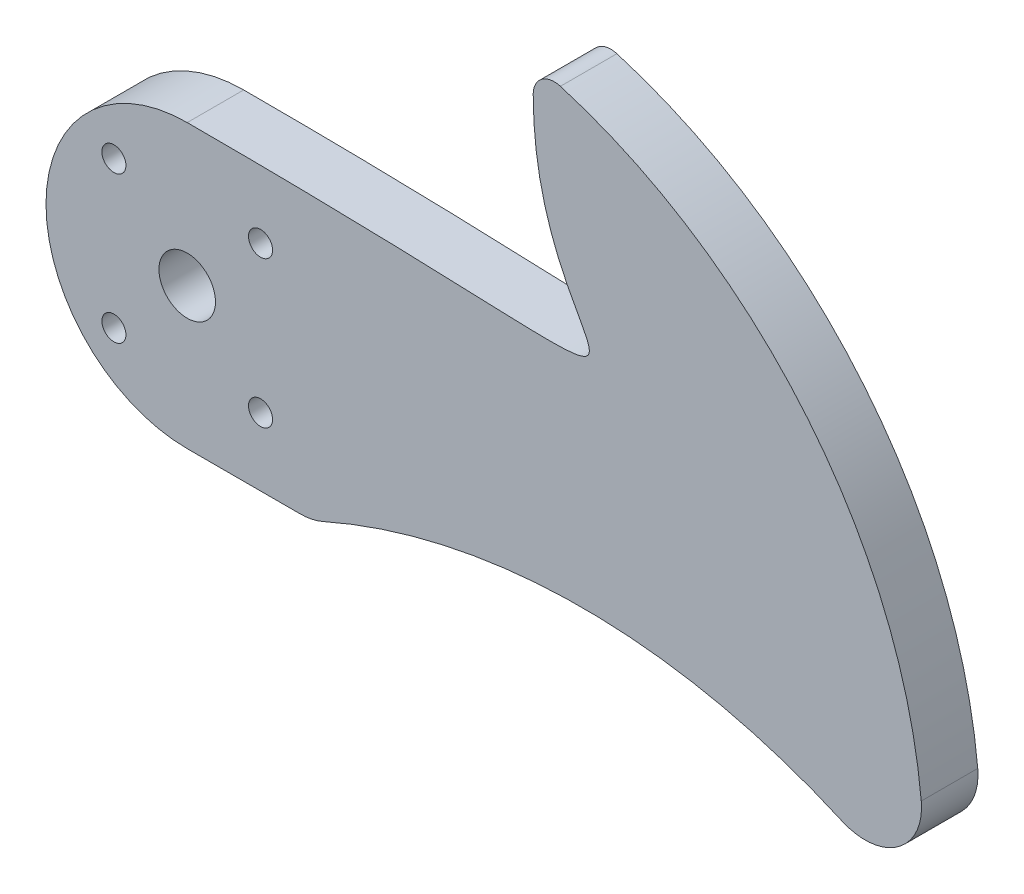
ISO-10303-21;
HEADER;
FILE_DESCRIPTION(('STEP AP214'),'2;1');
FILE_NAME('part.step','',(''),(''),'','','');
FILE_SCHEMA(('AUTOMOTIVE_DESIGN { 1 0 10303 214 1 1 1 1 }'));
ENDSEC;
DATA;
#1=APPLICATION_CONTEXT('core data for automotive mechanical design processes');
#2=APPLICATION_PROTOCOL_DEFINITION('international standard','automotive_design',2000,#1);
#3=PRODUCT_CONTEXT('',#1,'mechanical');
#4=PRODUCT('Part','Part','',(#3));
#5=PRODUCT_RELATED_PRODUCT_CATEGORY('part','',(#4));
#6=PRODUCT_DEFINITION_FORMATION('','',#4);
#7=PRODUCT_DEFINITION_CONTEXT('part definition',#1,'design');
#8=PRODUCT_DEFINITION('design','',#6,#7);
#9=PRODUCT_DEFINITION_SHAPE('','',#8);
#10=(LENGTH_UNIT() NAMED_UNIT(*) SI_UNIT(.MILLI.,.METRE.));
#11=(NAMED_UNIT(*) PLANE_ANGLE_UNIT() SI_UNIT($,.RADIAN.));
#12=(NAMED_UNIT(*) SI_UNIT($,.STERADIAN.) SOLID_ANGLE_UNIT());
#13=UNCERTAINTY_MEASURE_WITH_UNIT(LENGTH_MEASURE(1.E-05),#10,'distance_accuracy_value','');
#14=(GEOMETRIC_REPRESENTATION_CONTEXT(3) GLOBAL_UNCERTAINTY_ASSIGNED_CONTEXT((#13)) GLOBAL_UNIT_ASSIGNED_CONTEXT((#10,
#11,#12)) REPRESENTATION_CONTEXT('',''));
#15=CARTESIAN_POINT('',(0.,0.,0.));
#16=DIRECTION('',(0.,0.,1.));
#17=DIRECTION('',(1.,0.,0.));
#18=AXIS2_PLACEMENT_3D('',#15,#16,#17);
#19=CARTESIAN_POINT('',(0.,0.,6.35));
#20=DIRECTION('',(0.,0.,1.));
#21=DIRECTION('',(1.,0.,0.));
#22=AXIS2_PLACEMENT_3D('',#19,#20,#21);
#23=PLANE('',#22);
#24=CARTESIAN_POINT('',(8.24239019490099,8.24239019490099,6.35));
#25=DIRECTION('',(0.,0.,1.));
#26=DIRECTION('',(1.,0.,0.));
#27=AXIS2_PLACEMENT_3D('',#24,#25,#26);
#28=CIRCLE('',#27,1.35254999999999);
#29=CARTESIAN_POINT('',(9.59494019490098,8.24239019490099,6.35));
#30=VERTEX_POINT('',#29);
#31=EDGE_CURVE('E247',#30,#30,#28,.T.);
#32=ORIENTED_EDGE('',*,*,#31,.F.);
#33=EDGE_LOOP('',(#32));
#34=FACE_BOUND('',#33,.T.);
#35=CARTESIAN_POINT('',(-8.24239019490106,8.24239019490092,6.35));
#36=DIRECTION('',(0.,0.,1.));
#37=DIRECTION('',(1.,0.,0.));
#38=AXIS2_PLACEMENT_3D('',#35,#36,#37);
#39=CIRCLE('',#38,1.35254999999999);
#40=CARTESIAN_POINT('',(-6.88984019490108,8.24239019490092,6.35));
#41=VERTEX_POINT('',#40);
#42=EDGE_CURVE('E257',#41,#41,#39,.T.);
#43=ORIENTED_EDGE('',*,*,#42,.F.);
#44=EDGE_LOOP('',(#43));
#45=FACE_BOUND('',#44,.T.);
#46=CARTESIAN_POINT('',(8.24239019490106,-8.24239019490092,6.35));
#47=DIRECTION('',(0.,0.,1.));
#48=DIRECTION('',(1.,0.,0.));
#49=AXIS2_PLACEMENT_3D('',#46,#47,#48);
#50=CIRCLE('',#49,1.35254999999999);
#51=CARTESIAN_POINT('',(9.59494019490105,-8.24239019490092,6.35));
#52=VERTEX_POINT('',#51);
#53=EDGE_CURVE('E265',#52,#52,#50,.T.);
#54=ORIENTED_EDGE('',*,*,#53,.F.);
#55=EDGE_LOOP('',(#54));
#56=FACE_BOUND('',#55,.T.);
#57=CARTESIAN_POINT('',(-8.24239019490099,-8.24239019490099,6.35));
#58=DIRECTION('',(0.,0.,1.));
#59=DIRECTION('',(1.,0.,0.));
#60=AXIS2_PLACEMENT_3D('',#57,#58,#59);
#61=CIRCLE('',#60,1.35254999999999);
#62=CARTESIAN_POINT('',(-6.889840194901,-8.24239019490099,6.35));
#63=VERTEX_POINT('',#62);
#64=EDGE_CURVE('E273',#63,#63,#61,.T.);
#65=ORIENTED_EDGE('',*,*,#64,.F.);
#66=EDGE_LOOP('',(#65));
#67=FACE_BOUND('',#66,.T.);
#68=CARTESIAN_POINT('',(0.,0.,6.35));
#69=DIRECTION('',(0.,0.,1.));
#70=DIRECTION('',(1.,0.,0.));
#71=AXIS2_PLACEMENT_3D('',#68,#69,#70);
#72=CIRCLE('',#71,15.875);
#73=CARTESIAN_POINT('',(-1.2140077555456E-13,15.875,6.35));
#74=VERTEX_POINT('',#73);
#75=CARTESIAN_POINT('',(0.,-15.875,6.35));
#76=VERTEX_POINT('',#75);
#77=EDGE_CURVE('E285',#74,#76,#72,.T.);
#78=ORIENTED_EDGE('',*,*,#77,.T.);
#79=DIRECTION('',(1.,0.,0.));
#80=VECTOR('',#79,1.);
#81=CARTESIAN_POINT('',(0.,-15.875,6.35));
#82=LINE('',#81,#80);
#83=CARTESIAN_POINT('',(12.7,-15.875,6.35));
#84=VERTEX_POINT('',#83);
#85=EDGE_CURVE('E117',#76,#84,#82,.T.);
#86=ORIENTED_EDGE('',*,*,#85,.T.);
#87=CARTESIAN_POINT('',(12.7,-9.525,6.35));
#88=DIRECTION('',(0.,0.,1.));
#89=DIRECTION('',(1.,0.,0.));
#90=AXIS2_PLACEMENT_3D('',#87,#88,#89);
#91=CIRCLE('',#90,6.35);
#92=CARTESIAN_POINT('',(15.277486023345,-15.328366764169,6.35));
#93=VERTEX_POINT('',#92);
#94=EDGE_CURVE('E290',#84,#93,#91,.T.);
#95=ORIENTED_EDGE('',*,*,#94,.T.);
#96=CARTESIAN_POINT('',(44.45,-81.0120587438702,6.35));
#97=DIRECTION('',(0.,0.,-1.));
#98=DIRECTION('',(-1.,0.,0.));
#99=AXIS2_PLACEMENT_3D('',#96,#97,#98);
#100=CIRCLE('',#99,71.8705987438702);
#101=CARTESIAN_POINT('',(73.622513976655,-15.328366764169,6.35));
#102=VERTEX_POINT('',#101);
#103=EDGE_CURVE('E293',#93,#102,#100,.T.);
#104=ORIENTED_EDGE('',*,*,#103,.T.);
#105=CARTESIAN_POINT('',(76.2,-9.525,6.35));
#106=DIRECTION('',(0.,0.,1.));
#107=DIRECTION('',(1.,0.,0.));
#108=AXIS2_PLACEMENT_3D('',#105,#106,#107);
#109=CIRCLE('',#108,6.35000000000001);
#110=CARTESIAN_POINT('',(82.5208419600416,-8.91717032305285,6.35));
#111=VERTEX_POINT('',#110);
#112=EDGE_CURVE('E136',#102,#111,#109,.T.);
#113=ORIENTED_EDGE('',*,*,#112,.T.);
#114=CARTESIAN_POINT('',(25.6332643196673,-14.3876374155773,6.35));
#115=DIRECTION('',(0.,0.,1.));
#116=DIRECTION('',(-1.,0.,0.));
#117=AXIS2_PLACEMENT_3D('',#114,#115,#116);
#118=CIRCLE('',#117,57.15);
#119=CARTESIAN_POINT('',(41.9550754643623,40.3820711919816,6.35));
#120=VERTEX_POINT('',#119);
#121=EDGE_CURVE('E130',#111,#120,#118,.T.);
#122=ORIENTED_EDGE('',*,*,#121,.T.);
#123=CARTESIAN_POINT('',(41.275,38.1,6.35));
#124=DIRECTION('',(0.,0.,1.));
#125=DIRECTION('',(1.,0.,0.));
#126=AXIS2_PLACEMENT_3D('',#123,#124,#125);
#127=CIRCLE('',#126,2.38125);
#128=CARTESIAN_POINT('',(38.89375,38.1,6.35));
#129=VERTEX_POINT('',#128);
#130=EDGE_CURVE('E134',#120,#129,#127,.T.);
#131=ORIENTED_EDGE('',*,*,#130,.T.);
#132=CARTESIAN_POINT('',(38.89375,38.1,6.35));
#133=CARTESIAN_POINT('',(38.89375,8.24061993876244,6.35));
#134=CARTESIAN_POINT('',(68.3425609437508,15.875,6.35));
#135=CARTESIAN_POINT('',(-1.2140077555456E-13,15.875,6.35));
#136=B_SPLINE_CURVE_WITH_KNOTS('',3,(#132,#133,#134,#135),.UNSPECIFIED.,.F.,.F.,(4,4),(0.,1.),.UNSPECIFIED.);
#137=EDGE_CURVE('E68',#129,#74,#136,.T.);
#138=ORIENTED_EDGE('',*,*,#137,.T.);
#139=EDGE_LOOP('',(#78,#86,#95,#104,#113,#122,#131,#138));
#140=FACE_BOUND('',#139,.T.);
#141=CARTESIAN_POINT('',(0.,0.,6.35));
#142=DIRECTION('',(0.,0.,1.));
#143=DIRECTION('',(1.,0.,0.));
#144=AXIS2_PLACEMENT_3D('',#141,#142,#143);
#145=CIRCLE('',#144,3.175);
#146=CARTESIAN_POINT('',(3.175,0.,6.35));
#147=VERTEX_POINT('',#146);
#148=EDGE_CURVE('E281',#147,#147,#145,.T.);
#149=ORIENTED_EDGE('',*,*,#148,.F.);
#150=EDGE_LOOP('',(#149));
#151=FACE_BOUND('',#150,.T.);
#152=ADVANCED_FACE('F46',(#34,#45,#56,#67,#140,#151),#23,.T.);
#153=CARTESIAN_POINT('',(0.,0.,0.));
#154=DIRECTION('',(0.,0.,1.));
#155=DIRECTION('',(1.,0.,0.));
#156=AXIS2_PLACEMENT_3D('',#153,#154,#155);
#157=PLANE('',#156);
#158=CARTESIAN_POINT('',(0.,0.,0.));
#159=DIRECTION('',(0.,0.,-1.));
#160=DIRECTION('',(-1.,0.,0.));
#161=AXIS2_PLACEMENT_3D('',#158,#159,#160);
#162=CIRCLE('',#161,7.);
#163=CARTESIAN_POINT('',(-7.,0.,0.));
#164=VERTEX_POINT('',#163);
#165=EDGE_CURVE('E11',#164,#164,#162,.T.);
#166=ORIENTED_EDGE('',*,*,#165,.F.);
#167=EDGE_LOOP('',(#166));
#168=FACE_BOUND('',#167,.T.);
#169=CARTESIAN_POINT('',(8.24239019490099,8.24239019490099,0.));
#170=DIRECTION('',(0.,0.,1.));
#171=DIRECTION('',(1.,0.,0.));
#172=AXIS2_PLACEMENT_3D('',#169,#170,#171);
#173=CIRCLE('',#172,1.35254999999999);
#174=CARTESIAN_POINT('',(9.59494019490098,8.24239019490099,0.));
#175=VERTEX_POINT('',#174);
#176=EDGE_CURVE('E253',#175,#175,#173,.T.);
#177=ORIENTED_EDGE('',*,*,#176,.T.);
#178=EDGE_LOOP('',(#177));
#179=FACE_BOUND('',#178,.T.);
#180=CARTESIAN_POINT('',(-8.24239019490106,8.24239019490092,0.));
#181=DIRECTION('',(0.,0.,1.));
#182=DIRECTION('',(1.,0.,0.));
#183=AXIS2_PLACEMENT_3D('',#180,#181,#182);
#184=CIRCLE('',#183,1.35254999999999);
#185=CARTESIAN_POINT('',(-6.88984019490108,8.24239019490092,0.));
#186=VERTEX_POINT('',#185);
#187=EDGE_CURVE('E261',#186,#186,#184,.T.);
#188=ORIENTED_EDGE('',*,*,#187,.T.);
#189=EDGE_LOOP('',(#188));
#190=FACE_BOUND('',#189,.T.);
#191=CARTESIAN_POINT('',(8.24239019490106,-8.24239019490092,0.));
#192=DIRECTION('',(0.,0.,1.));
#193=DIRECTION('',(1.,0.,0.));
#194=AXIS2_PLACEMENT_3D('',#191,#192,#193);
#195=CIRCLE('',#194,1.35254999999999);
#196=CARTESIAN_POINT('',(9.59494019490105,-8.24239019490092,0.));
#197=VERTEX_POINT('',#196);
#198=EDGE_CURVE('E269',#197,#197,#195,.T.);
#199=ORIENTED_EDGE('',*,*,#198,.T.);
#200=EDGE_LOOP('',(#199));
#201=FACE_BOUND('',#200,.T.);
#202=CARTESIAN_POINT('',(-8.24239019490099,-8.24239019490099,0.));
#203=DIRECTION('',(0.,0.,1.));
#204=DIRECTION('',(1.,0.,0.));
#205=AXIS2_PLACEMENT_3D('',#202,#203,#204);
#206=CIRCLE('',#205,1.35254999999999);
#207=CARTESIAN_POINT('',(-6.889840194901,-8.24239019490099,0.));
#208=VERTEX_POINT('',#207);
#209=EDGE_CURVE('E277',#208,#208,#206,.T.);
#210=ORIENTED_EDGE('',*,*,#209,.T.);
#211=EDGE_LOOP('',(#210));
#212=FACE_BOUND('',#211,.T.);
#213=CARTESIAN_POINT('',(0.,0.,0.));
#214=DIRECTION('',(0.,0.,1.));
#215=DIRECTION('',(1.,0.,0.));
#216=AXIS2_PLACEMENT_3D('',#213,#214,#215);
#217=CIRCLE('',#216,15.875);
#218=CARTESIAN_POINT('',(-1.2140077555456E-13,15.875,0.));
#219=VERTEX_POINT('',#218);
#220=CARTESIAN_POINT('',(0.,-15.875,0.));
#221=VERTEX_POINT('',#220);
#222=EDGE_CURVE('E163',#219,#221,#217,.T.);
#223=ORIENTED_EDGE('',*,*,#222,.F.);
#224=CARTESIAN_POINT('',(38.89375,38.1,0.));
#225=CARTESIAN_POINT('',(38.89375,8.24061993876244,0.));
#226=CARTESIAN_POINT('',(68.3425609437508,15.875,0.));
#227=CARTESIAN_POINT('',(-1.2140077555456E-13,15.875,0.));
#228=B_SPLINE_CURVE_WITH_KNOTS('',3,(#224,#225,#226,#227),.UNSPECIFIED.,.F.,.F.,(4,4),(0.,1.),.UNSPECIFIED.);
#229=CARTESIAN_POINT('',(38.89375,38.1,0.));
#230=VERTEX_POINT('',#229);
#231=EDGE_CURVE('E107',#230,#219,#228,.T.);
#232=ORIENTED_EDGE('',*,*,#231,.F.);
#233=CARTESIAN_POINT('',(41.275,38.1,0.));
#234=DIRECTION('',(0.,0.,1.));
#235=DIRECTION('',(1.,0.,0.));
#236=AXIS2_PLACEMENT_3D('',#233,#234,#235);
#237=CIRCLE('',#236,2.38125);
#238=CARTESIAN_POINT('',(41.9550754643623,40.3820711919816,0.));
#239=VERTEX_POINT('',#238);
#240=EDGE_CURVE('E101',#239,#230,#237,.T.);
#241=ORIENTED_EDGE('',*,*,#240,.F.);
#242=CARTESIAN_POINT('',(25.6332643196673,-14.3876374155773,0.));
#243=DIRECTION('',(0.,0.,1.));
#244=DIRECTION('',(-1.,0.,0.));
#245=AXIS2_PLACEMENT_3D('',#242,#243,#244);
#246=CIRCLE('',#245,57.15);
#247=CARTESIAN_POINT('',(82.5208419600416,-8.91717032305285,0.));
#248=VERTEX_POINT('',#247);
#249=EDGE_CURVE('E145',#248,#239,#246,.T.);
#250=ORIENTED_EDGE('',*,*,#249,.F.);
#251=CARTESIAN_POINT('',(76.2,-9.525,0.));
#252=DIRECTION('',(0.,0.,1.));
#253=DIRECTION('',(1.,0.,0.));
#254=AXIS2_PLACEMENT_3D('',#251,#252,#253);
#255=CIRCLE('',#254,6.35000000000001);
#256=CARTESIAN_POINT('',(73.622513976655,-15.328366764169,0.));
#257=VERTEX_POINT('',#256);
#258=EDGE_CURVE('E319',#257,#248,#255,.T.);
#259=ORIENTED_EDGE('',*,*,#258,.F.);
#260=CARTESIAN_POINT('',(44.45,-81.0120587438702,0.));
#261=DIRECTION('',(0.,0.,-1.));
#262=DIRECTION('',(-1.,0.,0.));
#263=AXIS2_PLACEMENT_3D('',#260,#261,#262);
#264=CIRCLE('',#263,71.8705987438702);
#265=CARTESIAN_POINT('',(15.277486023345,-15.328366764169,0.));
#266=VERTEX_POINT('',#265);
#267=EDGE_CURVE('E323',#266,#257,#264,.T.);
#268=ORIENTED_EDGE('',*,*,#267,.F.);
#269=CARTESIAN_POINT('',(12.7,-9.525,0.));
#270=DIRECTION('',(0.,0.,1.));
#271=DIRECTION('',(1.,0.,0.));
#272=AXIS2_PLACEMENT_3D('',#269,#270,#271);
#273=CIRCLE('',#272,6.35);
#274=CARTESIAN_POINT('',(12.7,-15.875,0.));
#275=VERTEX_POINT('',#274);
#276=EDGE_CURVE('E327',#275,#266,#273,.T.);
#277=ORIENTED_EDGE('',*,*,#276,.F.);
#278=DIRECTION('',(1.,0.,0.));
#279=VECTOR('',#278,1.);
#280=CARTESIAN_POINT('',(0.,-15.875,0.));
#281=LINE('',#280,#279);
#282=EDGE_CURVE('E331',#221,#275,#281,.T.);
#283=ORIENTED_EDGE('',*,*,#282,.F.);
#284=EDGE_LOOP('',(#223,#232,#241,#250,#259,#268,#277,#283));
#285=FACE_BOUND('',#284,.T.);
#286=ADVANCED_FACE('F174',(#168,#179,#190,#201,#212,#285),#157,.F.);
#287=CARTESIAN_POINT('',(0.,0.,6.35));
#288=DIRECTION('',(0.,0.,-1.));
#289=DIRECTION('',(-1.,0.,0.));
#290=AXIS2_PLACEMENT_3D('',#287,#288,#289);
#291=CYLINDRICAL_SURFACE('',#290,15.875);
#292=ORIENTED_EDGE('',*,*,#222,.T.);
#293=DIRECTION('',(0.,0.,-1.));
#294=VECTOR('',#293,1.);
#295=CARTESIAN_POINT('',(0.,-15.875,6.35));
#296=LINE('',#295,#294);
#297=EDGE_CURVE('E50',#76,#221,#296,.T.);
#298=ORIENTED_EDGE('',*,*,#297,.F.);
#299=ORIENTED_EDGE('',*,*,#77,.F.);
#300=DIRECTION('',(0.,0.,-1.));
#301=VECTOR('',#300,1.);
#302=CARTESIAN_POINT('',(-1.2140077555456E-13,15.875,6.35));
#303=LINE('',#302,#301);
#304=EDGE_CURVE('E156',#74,#219,#303,.T.);
#305=ORIENTED_EDGE('',*,*,#304,.T.);
#306=EDGE_LOOP('',(#292,#298,#299,#305));
#307=FACE_BOUND('',#306,.T.);
#308=ADVANCED_FACE('F48',(#307),#291,.T.);
#309=CARTESIAN_POINT('',(0.,-15.875,6.35));
#310=DIRECTION('',(0.,1.,0.));
#311=DIRECTION('',(0.,0.,1.));
#312=AXIS2_PLACEMENT_3D('',#309,#310,#311);
#313=PLANE('',#312);
#314=ORIENTED_EDGE('',*,*,#282,.T.);
#315=DIRECTION('',(0.,0.,-1.));
#316=VECTOR('',#315,1.);
#317=CARTESIAN_POINT('',(12.7,-15.875,6.35));
#318=LINE('',#317,#316);
#319=EDGE_CURVE('E386',#84,#275,#318,.T.);
#320=ORIENTED_EDGE('',*,*,#319,.F.);
#321=ORIENTED_EDGE('',*,*,#85,.F.);
#322=ORIENTED_EDGE('',*,*,#297,.T.);
#323=EDGE_LOOP('',(#314,#320,#321,#322));
#324=FACE_BOUND('',#323,.T.);
#325=ADVANCED_FACE('F190',(#324),#313,.F.);
#326=CARTESIAN_POINT('',(12.7,-9.525,6.35));
#327=DIRECTION('',(0.,0.,-1.));
#328=DIRECTION('',(-1.,0.,0.));
#329=AXIS2_PLACEMENT_3D('',#326,#327,#328);
#330=CYLINDRICAL_SURFACE('',#329,6.35);
#331=ORIENTED_EDGE('',*,*,#276,.T.);
#332=DIRECTION('',(0.,0.,-1.));
#333=VECTOR('',#332,1.);
#334=CARTESIAN_POINT('',(15.277486023345,-15.328366764169,6.35));
#335=LINE('',#334,#333);
#336=EDGE_CURVE('E381',#93,#266,#335,.T.);
#337=ORIENTED_EDGE('',*,*,#336,.F.);
#338=ORIENTED_EDGE('',*,*,#94,.F.);
#339=ORIENTED_EDGE('',*,*,#319,.T.);
#340=EDGE_LOOP('',(#331,#337,#338,#339));
#341=FACE_BOUND('',#340,.T.);
#342=ADVANCED_FACE('F187',(#341),#330,.T.);
#343=CARTESIAN_POINT('',(44.45,-81.0120587438702,6.35));
#344=DIRECTION('',(0.,0.,-1.));
#345=DIRECTION('',(-1.,0.,0.));
#346=AXIS2_PLACEMENT_3D('',#343,#344,#345);
#347=CYLINDRICAL_SURFACE('',#346,71.8705987438702);
#348=ORIENTED_EDGE('',*,*,#267,.T.);
#349=DIRECTION('',(0.,0.,-1.));
#350=VECTOR('',#349,1.);
#351=CARTESIAN_POINT('',(73.622513976655,-15.328366764169,6.35));
#352=LINE('',#351,#350);
#353=EDGE_CURVE('E376',#102,#257,#352,.T.);
#354=ORIENTED_EDGE('',*,*,#353,.F.);
#355=ORIENTED_EDGE('',*,*,#103,.F.);
#356=ORIENTED_EDGE('',*,*,#336,.T.);
#357=EDGE_LOOP('',(#348,#354,#355,#356));
#358=FACE_BOUND('',#357,.T.);
#359=ADVANCED_FACE('F183',(#358),#347,.F.);
#360=CARTESIAN_POINT('',(76.2,-9.525,6.35));
#361=DIRECTION('',(0.,0.,-1.));
#362=DIRECTION('',(-1.,0.,0.));
#363=AXIS2_PLACEMENT_3D('',#360,#361,#362);
#364=CYLINDRICAL_SURFACE('',#363,6.35000000000001);
#365=ORIENTED_EDGE('',*,*,#258,.T.);
#366=DIRECTION('',(0.,0.,-1.));
#367=VECTOR('',#366,1.);
#368=CARTESIAN_POINT('',(82.5208419600416,-8.91717032305285,6.35));
#369=LINE('',#368,#367);
#370=EDGE_CURVE('E147',#111,#248,#369,.T.);
#371=ORIENTED_EDGE('',*,*,#370,.F.);
#372=ORIENTED_EDGE('',*,*,#112,.F.);
#373=ORIENTED_EDGE('',*,*,#353,.T.);
#374=EDGE_LOOP('',(#365,#371,#372,#373));
#375=FACE_BOUND('',#374,.T.);
#376=ADVANCED_FACE('F180',(#375),#364,.T.);
#377=CARTESIAN_POINT('',(25.6332643196673,-14.3876374155773,6.35));
#378=DIRECTION('',(0.,0.,-1.));
#379=DIRECTION('',(-1.,0.,0.));
#380=AXIS2_PLACEMENT_3D('',#377,#378,#379);
#381=CYLINDRICAL_SURFACE('',#380,57.15);
#382=ORIENTED_EDGE('',*,*,#249,.T.);
#383=DIRECTION('',(0.,0.,-1.));
#384=VECTOR('',#383,1.);
#385=CARTESIAN_POINT('',(41.9550754643623,40.3820711919816,6.35));
#386=LINE('',#385,#384);
#387=EDGE_CURVE('E142',#120,#239,#386,.T.);
#388=ORIENTED_EDGE('',*,*,#387,.F.);
#389=ORIENTED_EDGE('',*,*,#121,.F.);
#390=ORIENTED_EDGE('',*,*,#370,.T.);
#391=EDGE_LOOP('',(#382,#388,#389,#390));
#392=FACE_BOUND('',#391,.T.);
#393=ADVANCED_FACE('F143',(#392),#381,.T.);
#394=CARTESIAN_POINT('',(41.275,38.1,6.35));
#395=DIRECTION('',(0.,0.,-1.));
#396=DIRECTION('',(-1.,0.,0.));
#397=AXIS2_PLACEMENT_3D('',#394,#395,#396);
#398=CYLINDRICAL_SURFACE('',#397,2.38125);
#399=ORIENTED_EDGE('',*,*,#240,.T.);
#400=DIRECTION('',(0.,0.,-1.));
#401=VECTOR('',#400,1.);
#402=CARTESIAN_POINT('',(38.89375,38.1,6.35));
#403=LINE('',#402,#401);
#404=EDGE_CURVE('E148',#129,#230,#403,.T.);
#405=ORIENTED_EDGE('',*,*,#404,.F.);
#406=ORIENTED_EDGE('',*,*,#130,.F.);
#407=ORIENTED_EDGE('',*,*,#387,.T.);
#408=EDGE_LOOP('',(#399,#405,#406,#407));
#409=FACE_BOUND('',#408,.T.);
#410=ADVANCED_FACE('F150',(#409),#398,.T.);
#411=DIRECTION('',(0.,0.,-1.));
#412=VECTOR('',#411,1.);
#413=SURFACE_OF_LINEAR_EXTRUSION('',#136,#412);
#414=ORIENTED_EDGE('',*,*,#231,.T.);
#415=ORIENTED_EDGE('',*,*,#304,.F.);
#416=ORIENTED_EDGE('',*,*,#137,.F.);
#417=ORIENTED_EDGE('',*,*,#404,.T.);
#418=EDGE_LOOP('',(#414,#415,#416,#417));
#419=FACE_BOUND('',#418,.T.);
#420=ADVANCED_FACE('F169',(#419),#413,.F.);
#421=CARTESIAN_POINT('',(0.,0.,6.35));
#422=DIRECTION('',(0.,0.,-1.));
#423=DIRECTION('',(-1.,0.,0.));
#424=AXIS2_PLACEMENT_3D('',#421,#422,#423);
#425=CYLINDRICAL_SURFACE('',#424,3.175);
#426=ORIENTED_EDGE('',*,*,#148,.T.);
#427=EDGE_LOOP('',(#426));
#428=FACE_BOUND('',#427,.T.);
#429=CARTESIAN_POINT('',(0.,0.,-1.5875));
#430=DIRECTION('',(0.,0.,-1.));
#431=DIRECTION('',(-1.,0.,0.));
#432=AXIS2_PLACEMENT_3D('',#429,#430,#431);
#433=CIRCLE('',#432,3.175);
#434=CARTESIAN_POINT('',(-3.175,0.,-1.5875));
#435=VERTEX_POINT('',#434);
#436=EDGE_CURVE('E240',#435,#435,#433,.T.);
#437=ORIENTED_EDGE('',*,*,#436,.T.);
#438=EDGE_LOOP('',(#437));
#439=FACE_BOUND('',#438,.T.);
#440=ADVANCED_FACE('F173',(#428,#439),#425,.F.);
#441=CARTESIAN_POINT('',(-8.24239019490099,-8.24239019490099,6.35));
#442=DIRECTION('',(0.,0.,1.));
#443=DIRECTION('',(1.,0.,0.));
#444=AXIS2_PLACEMENT_3D('',#441,#442,#443);
#445=CYLINDRICAL_SURFACE('',#444,1.35254999999999);
#446=ORIENTED_EDGE('',*,*,#209,.F.);
#447=EDGE_LOOP('',(#446));
#448=FACE_BOUND('',#447,.T.);
#449=ORIENTED_EDGE('',*,*,#64,.T.);
#450=EDGE_LOOP('',(#449));
#451=FACE_BOUND('',#450,.T.);
#452=ADVANCED_FACE('F208',(#448,#451),#445,.F.);
#453=CARTESIAN_POINT('',(8.24239019490106,-8.24239019490092,6.35));
#454=DIRECTION('',(0.,0.,1.));
#455=DIRECTION('',(1.,0.,0.));
#456=AXIS2_PLACEMENT_3D('',#453,#454,#455);
#457=CYLINDRICAL_SURFACE('',#456,1.35254999999999);
#458=ORIENTED_EDGE('',*,*,#198,.F.);
#459=EDGE_LOOP('',(#458));
#460=FACE_BOUND('',#459,.T.);
#461=ORIENTED_EDGE('',*,*,#53,.T.);
#462=EDGE_LOOP('',(#461));
#463=FACE_BOUND('',#462,.T.);
#464=ADVANCED_FACE('F212',(#460,#463),#457,.F.);
#465=CARTESIAN_POINT('',(-8.24239019490106,8.24239019490092,6.35));
#466=DIRECTION('',(0.,0.,1.));
#467=DIRECTION('',(1.,0.,0.));
#468=AXIS2_PLACEMENT_3D('',#465,#466,#467);
#469=CYLINDRICAL_SURFACE('',#468,1.35254999999999);
#470=ORIENTED_EDGE('',*,*,#187,.F.);
#471=EDGE_LOOP('',(#470));
#472=FACE_BOUND('',#471,.T.);
#473=ORIENTED_EDGE('',*,*,#42,.T.);
#474=EDGE_LOOP('',(#473));
#475=FACE_BOUND('',#474,.T.);
#476=ADVANCED_FACE('F216',(#472,#475),#469,.F.);
#477=CARTESIAN_POINT('',(8.24239019490099,8.24239019490099,6.35));
#478=DIRECTION('',(0.,0.,1.));
#479=DIRECTION('',(1.,0.,0.));
#480=AXIS2_PLACEMENT_3D('',#477,#478,#479);
#481=CYLINDRICAL_SURFACE('',#480,1.35254999999999);
#482=ORIENTED_EDGE('',*,*,#176,.F.);
#483=EDGE_LOOP('',(#482));
#484=FACE_BOUND('',#483,.T.);
#485=ORIENTED_EDGE('',*,*,#31,.T.);
#486=EDGE_LOOP('',(#485));
#487=FACE_BOUND('',#486,.T.);
#488=ADVANCED_FACE('F220',(#484,#487),#481,.F.);
#489=CARTESIAN_POINT('',(0.,0.,-1.5875));
#490=DIRECTION('',(0.,0.,-1.));
#491=DIRECTION('',(-1.,0.,0.));
#492=AXIS2_PLACEMENT_3D('',#489,#490,#491);
#493=PLANE('',#492);
#494=CARTESIAN_POINT('',(0.,0.,-1.5875));
#495=DIRECTION('',(0.,0.,-1.));
#496=DIRECTION('',(-1.,0.,0.));
#497=AXIS2_PLACEMENT_3D('',#494,#495,#496);
#498=CIRCLE('',#497,7.);
#499=CARTESIAN_POINT('',(-7.,0.,-1.5875));
#500=VERTEX_POINT('',#499);
#501=EDGE_CURVE('E237',#500,#500,#498,.T.);
#502=ORIENTED_EDGE('',*,*,#501,.T.);
#503=EDGE_LOOP('',(#502));
#504=FACE_BOUND('',#503,.T.);
#505=ORIENTED_EDGE('',*,*,#436,.F.);
#506=EDGE_LOOP('',(#505));
#507=FACE_BOUND('',#506,.T.);
#508=ADVANCED_FACE('F224',(#504,#507),#493,.T.);
#509=CARTESIAN_POINT('',(0.,0.,-1.5875));
#510=DIRECTION('',(0.,0.,1.));
#511=DIRECTION('',(1.,0.,0.));
#512=AXIS2_PLACEMENT_3D('',#509,#510,#511);
#513=CYLINDRICAL_SURFACE('',#512,7.);
#514=ORIENTED_EDGE('',*,*,#501,.F.);
#515=EDGE_LOOP('',(#514));
#516=FACE_BOUND('',#515,.T.);
#517=ORIENTED_EDGE('',*,*,#165,.T.);
#518=EDGE_LOOP('',(#517));
#519=FACE_BOUND('',#518,.T.);
#520=ADVANCED_FACE('F226',(#516,#519),#513,.T.);
#521=CLOSED_SHELL('',(#152,#286,#308,#325,#342,#359,#376,#393,#410,#420,#440,#452,#464,#476,
#488,#508,#520));
#522=MANIFOLD_SOLID_BREP('B2',#521);
#523=ADVANCED_BREP_SHAPE_REPRESENTATION('',(#18,#522),#14);
#524=SHAPE_DEFINITION_REPRESENTATION(#9,#523);
ENDSEC;
END-ISO-10303-21;
